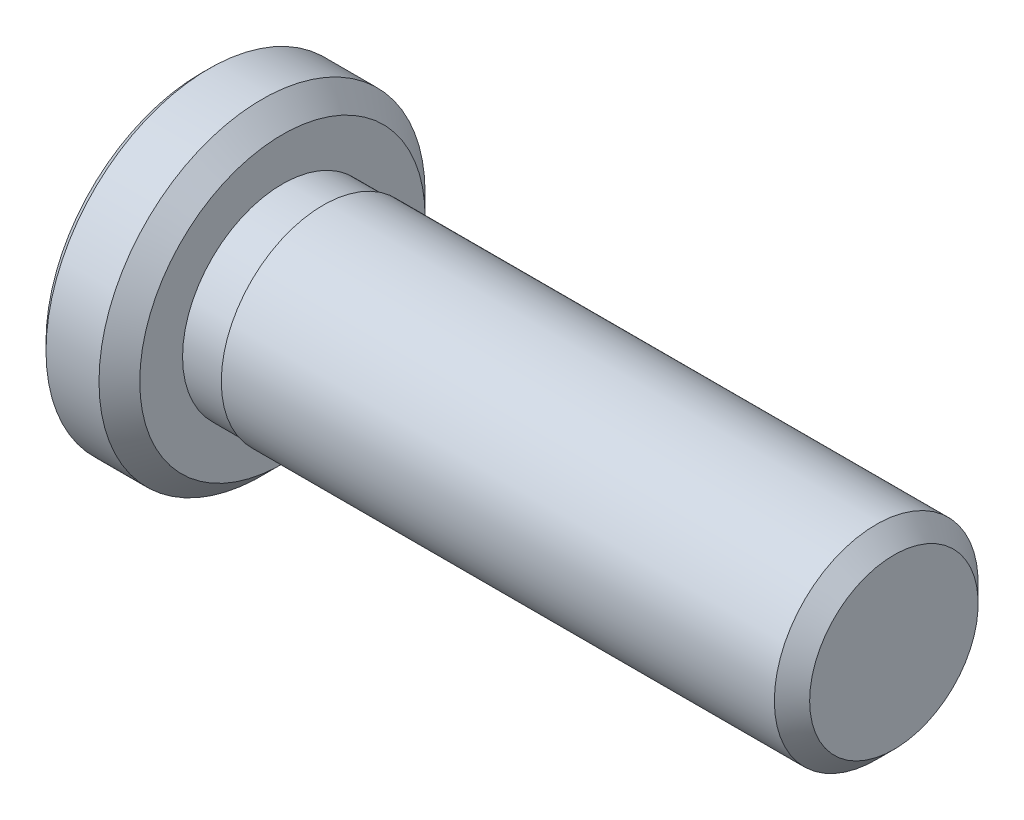
ISO-10303-21;
HEADER;
FILE_DESCRIPTION(('STEP AP214'),'2;1');
FILE_NAME('part.step','',(''),(''),'','','');
FILE_SCHEMA(('AUTOMOTIVE_DESIGN { 1 0 10303 214 1 1 1 1 }'));
ENDSEC;
DATA;
#1=APPLICATION_CONTEXT('core data for automotive mechanical design processes');
#2=APPLICATION_PROTOCOL_DEFINITION('international standard','automotive_design',2000,#1);
#3=PRODUCT_CONTEXT('',#1,'mechanical');
#4=PRODUCT('Part','Part','',(#3));
#5=PRODUCT_RELATED_PRODUCT_CATEGORY('part','',(#4));
#6=PRODUCT_DEFINITION_FORMATION('','',#4);
#7=PRODUCT_DEFINITION_CONTEXT('part definition',#1,'design');
#8=PRODUCT_DEFINITION('design','',#6,#7);
#9=PRODUCT_DEFINITION_SHAPE('','',#8);
#10=(LENGTH_UNIT() NAMED_UNIT(*) SI_UNIT(.MILLI.,.METRE.));
#11=(NAMED_UNIT(*) PLANE_ANGLE_UNIT() SI_UNIT($,.RADIAN.));
#12=(NAMED_UNIT(*) SI_UNIT($,.STERADIAN.) SOLID_ANGLE_UNIT());
#13=UNCERTAINTY_MEASURE_WITH_UNIT(LENGTH_MEASURE(1.E-05),#10,'distance_accuracy_value','');
#14=(GEOMETRIC_REPRESENTATION_CONTEXT(3) GLOBAL_UNCERTAINTY_ASSIGNED_CONTEXT((#13)) GLOBAL_UNIT_ASSIGNED_CONTEXT((#10,
#11,#12)) REPRESENTATION_CONTEXT('',''));
#15=CARTESIAN_POINT('',(0.,0.,0.));
#16=DIRECTION('',(0.,0.,1.));
#17=DIRECTION('',(1.,0.,0.));
#18=AXIS2_PLACEMENT_3D('',#15,#16,#17);
#19=CARTESIAN_POINT('',(-2.,0.,0.));
#20=DIRECTION('',(1.,0.,0.));
#21=DIRECTION('',(0.,0.,-1.));
#22=AXIS2_PLACEMENT_3D('',#19,#20,#21);
#23=PLANE('',#22);
#24=DIRECTION('',(0.,0.,1.));
#25=VECTOR('',#24,1.);
#26=CARTESIAN_POINT('',(-2.,-1.25,-0.72168783648703));
#27=LINE('',#26,#25);
#28=CARTESIAN_POINT('',(-2.,-1.25,-0.72168783648703));
#29=VERTEX_POINT('',#28);
#30=CARTESIAN_POINT('',(-2.,-1.25,0.72168783648703));
#31=VERTEX_POINT('',#30);
#32=EDGE_CURVE('E105',#29,#31,#27,.T.);
#33=ORIENTED_EDGE('',*,*,#32,.F.);
#34=DIRECTION('',(0.,-0.866025403784427,0.50000000000002));
#35=VECTOR('',#34,1.);
#36=CARTESIAN_POINT('',(-2.,0.,-1.4433756729741));
#37=LINE('',#36,#35);
#38=CARTESIAN_POINT('',(-2.,0.,-1.4433756729741));
#39=VERTEX_POINT('',#38);
#40=EDGE_CURVE('E31',#39,#29,#37,.T.);
#41=ORIENTED_EDGE('',*,*,#40,.F.);
#42=DIRECTION('',(0.,-0.866025403784427,-0.50000000000002));
#43=VECTOR('',#42,1.);
#44=CARTESIAN_POINT('',(-2.,1.25,-0.72168783648703));
#45=LINE('',#44,#43);
#46=CARTESIAN_POINT('',(-2.,1.25,-0.72168783648703));
#47=VERTEX_POINT('',#46);
#48=EDGE_CURVE('E114',#47,#39,#45,.T.);
#49=ORIENTED_EDGE('',*,*,#48,.F.);
#50=DIRECTION('',(0.,0.,-1.));
#51=VECTOR('',#50,1.);
#52=CARTESIAN_POINT('',(-2.,1.25,0.72168783648703));
#53=LINE('',#52,#51);
#54=CARTESIAN_POINT('',(-2.,1.25,0.72168783648703));
#55=VERTEX_POINT('',#54);
#56=EDGE_CURVE('E112',#55,#47,#53,.T.);
#57=ORIENTED_EDGE('',*,*,#56,.F.);
#58=DIRECTION('',(0.,0.866025403784427,-0.50000000000002));
#59=VECTOR('',#58,1.);
#60=CARTESIAN_POINT('',(-2.,0.,1.4433756729741));
#61=LINE('',#60,#59);
#62=CARTESIAN_POINT('',(-2.,0.,1.4433756729741));
#63=VERTEX_POINT('',#62);
#64=EDGE_CURVE('E79',#63,#55,#61,.T.);
#65=ORIENTED_EDGE('',*,*,#64,.F.);
#66=DIRECTION('',(0.,0.866025403784427,0.50000000000002));
#67=VECTOR('',#66,1.);
#68=CARTESIAN_POINT('',(-2.,-1.25,0.72168783648703));
#69=LINE('',#68,#67);
#70=EDGE_CURVE('E108',#31,#63,#69,.T.);
#71=ORIENTED_EDGE('',*,*,#70,.F.);
#72=EDGE_LOOP('',(#33,#41,#49,#57,#65,#71));
#73=FACE_BOUND('',#72,.T.);
#74=CARTESIAN_POINT('',(-2.,0.,0.));
#75=DIRECTION('',(-1.,0.,0.));
#76=DIRECTION('',(0.,0.,1.));
#77=AXIS2_PLACEMENT_3D('',#74,#75,#76);
#78=CIRCLE('',#77,3.8);
#79=CARTESIAN_POINT('',(-2.,0.,3.8));
#80=VERTEX_POINT('',#79);
#81=EDGE_CURVE('E11',#80,#80,#78,.T.);
#82=ORIENTED_EDGE('',*,*,#81,.T.);
#83=EDGE_LOOP('',(#82));
#84=FACE_BOUND('',#83,.T.);
#85=ADVANCED_FACE('F17',(#73,#84),#23,.F.);
#86=CARTESIAN_POINT('',(-1.8,0.,0.));
#87=DIRECTION('',(1.,0.,0.));
#88=DIRECTION('',(0.,0.,-1.));
#89=AXIS2_PLACEMENT_3D('',#86,#87,#88);
#90=CONICAL_SURFACE('',#89,4.,0.785398163397443);
#91=ORIENTED_EDGE('',*,*,#81,.F.);
#92=EDGE_LOOP('',(#91));
#93=FACE_BOUND('',#92,.T.);
#94=CARTESIAN_POINT('',(-1.8,0.,0.));
#95=DIRECTION('',(-1.,0.,0.));
#96=DIRECTION('',(0.,0.,1.));
#97=AXIS2_PLACEMENT_3D('',#94,#95,#96);
#98=CIRCLE('',#97,4.);
#99=CARTESIAN_POINT('',(-1.8,0.,4.));
#100=VERTEX_POINT('',#99);
#101=EDGE_CURVE('E24',#100,#100,#98,.T.);
#102=ORIENTED_EDGE('',*,*,#101,.T.);
#103=EDGE_LOOP('',(#102));
#104=FACE_BOUND('',#103,.T.);
#105=ADVANCED_FACE('F146',(#93,#104),#90,.T.);
#106=CARTESIAN_POINT('',(15.,0.,0.));
#107=DIRECTION('',(-1.,0.,0.));
#108=DIRECTION('',(0.,0.,1.));
#109=AXIS2_PLACEMENT_3D('',#106,#107,#108);
#110=CYLINDRICAL_SURFACE('',#109,4.);
#111=ORIENTED_EDGE('',*,*,#101,.F.);
#112=EDGE_LOOP('',(#111));
#113=FACE_BOUND('',#112,.T.);
#114=CARTESIAN_POINT('',(-0.5,0.,0.));
#115=DIRECTION('',(-1.,0.,0.));
#116=DIRECTION('',(0.,0.,1.));
#117=AXIS2_PLACEMENT_3D('',#114,#115,#116);
#118=CIRCLE('',#117,4.);
#119=CARTESIAN_POINT('',(-0.5,0.,4.));
#120=VERTEX_POINT('',#119);
#121=EDGE_CURVE('E141',#120,#120,#118,.T.);
#122=ORIENTED_EDGE('',*,*,#121,.T.);
#123=EDGE_LOOP('',(#122));
#124=FACE_BOUND('',#123,.T.);
#125=ADVANCED_FACE('F148',(#113,#124),#110,.T.);
#126=CARTESIAN_POINT('',(0.,0.,0.));
#127=DIRECTION('',(-1.,0.,0.));
#128=DIRECTION('',(0.,0.,1.));
#129=AXIS2_PLACEMENT_3D('',#126,#127,#128);
#130=CONICAL_SURFACE('',#129,3.5,0.785398163397448);
#131=ORIENTED_EDGE('',*,*,#121,.F.);
#132=EDGE_LOOP('',(#131));
#133=FACE_BOUND('',#132,.T.);
#134=CARTESIAN_POINT('',(0.,0.,0.));
#135=DIRECTION('',(-1.,0.,0.));
#136=DIRECTION('',(0.,0.,1.));
#137=AXIS2_PLACEMENT_3D('',#134,#135,#136);
#138=CIRCLE('',#137,3.5);
#139=CARTESIAN_POINT('',(0.,0.,3.5));
#140=VERTEX_POINT('',#139);
#141=EDGE_CURVE('E138',#140,#140,#138,.T.);
#142=ORIENTED_EDGE('',*,*,#141,.T.);
#143=EDGE_LOOP('',(#142));
#144=FACE_BOUND('',#143,.T.);
#145=ADVANCED_FACE('F151',(#133,#144),#130,.T.);
#146=CARTESIAN_POINT('',(0.,3.5,0.));
#147=DIRECTION('',(-1.,0.,0.));
#148=DIRECTION('',(0.,0.,1.));
#149=AXIS2_PLACEMENT_3D('',#146,#147,#148);
#150=PLANE('',#149);
#151=ORIENTED_EDGE('',*,*,#141,.F.);
#152=EDGE_LOOP('',(#151));
#153=FACE_BOUND('',#152,.T.);
#154=CARTESIAN_POINT('',(0.,0.,0.));
#155=DIRECTION('',(-1.,0.,0.));
#156=DIRECTION('',(0.,0.,1.));
#157=AXIS2_PLACEMENT_3D('',#154,#155,#156);
#158=CIRCLE('',#157,2.45);
#159=CARTESIAN_POINT('',(0.,0.,2.45));
#160=VERTEX_POINT('',#159);
#161=EDGE_CURVE('E135',#160,#160,#158,.T.);
#162=ORIENTED_EDGE('',*,*,#161,.T.);
#163=EDGE_LOOP('',(#162));
#164=FACE_BOUND('',#163,.T.);
#165=ADVANCED_FACE('F157',(#153,#164),#150,.F.);
#166=CARTESIAN_POINT('',(15.,0.,0.));
#167=DIRECTION('',(-1.,0.,0.));
#168=DIRECTION('',(0.,0.,1.));
#169=AXIS2_PLACEMENT_3D('',#166,#167,#168);
#170=CYLINDRICAL_SURFACE('',#169,2.45);
#171=ORIENTED_EDGE('',*,*,#161,.F.);
#172=EDGE_LOOP('',(#171));
#173=FACE_BOUND('',#172,.T.);
#174=CARTESIAN_POINT('',(1.,0.,0.));
#175=DIRECTION('',(-1.,0.,0.));
#176=DIRECTION('',(0.,0.,1.));
#177=AXIS2_PLACEMENT_3D('',#174,#175,#176);
#178=CIRCLE('',#177,2.45);
#179=CARTESIAN_POINT('',(1.,0.,2.45));
#180=VERTEX_POINT('',#179);
#181=EDGE_CURVE('E132',#180,#180,#178,.T.);
#182=ORIENTED_EDGE('',*,*,#181,.T.);
#183=EDGE_LOOP('',(#182));
#184=FACE_BOUND('',#183,.T.);
#185=ADVANCED_FACE('F163',(#173,#184),#170,.T.);
#186=CARTESIAN_POINT('',(1.,2.45,0.));
#187=DIRECTION('',(1.,0.,0.));
#188=DIRECTION('',(0.,0.,-1.));
#189=AXIS2_PLACEMENT_3D('',#186,#187,#188);
#190=PLANE('',#189);
#191=ORIENTED_EDGE('',*,*,#181,.F.);
#192=EDGE_LOOP('',(#191));
#193=FACE_BOUND('',#192,.T.);
#194=CARTESIAN_POINT('',(1.,0.,0.));
#195=DIRECTION('',(-1.,0.,0.));
#196=DIRECTION('',(0.,0.,1.));
#197=AXIS2_PLACEMENT_3D('',#194,#195,#196);
#198=CIRCLE('',#197,2.5);
#199=CARTESIAN_POINT('',(1.,0.,2.5));
#200=VERTEX_POINT('',#199);
#201=EDGE_CURVE('E129',#200,#200,#198,.T.);
#202=ORIENTED_EDGE('',*,*,#201,.T.);
#203=EDGE_LOOP('',(#202));
#204=FACE_BOUND('',#203,.T.);
#205=ADVANCED_FACE('F169',(#193,#204),#190,.F.);
#206=CARTESIAN_POINT('',(15.,0.,0.));
#207=DIRECTION('',(-1.,0.,0.));
#208=DIRECTION('',(0.,0.,1.));
#209=AXIS2_PLACEMENT_3D('',#206,#207,#208);
#210=CYLINDRICAL_SURFACE('',#209,2.5);
#211=ORIENTED_EDGE('',*,*,#201,.F.);
#212=EDGE_LOOP('',(#211));
#213=FACE_BOUND('',#212,.T.);
#214=CARTESIAN_POINT('',(14.567,0.,0.));
#215=DIRECTION('',(-1.,0.,0.));
#216=DIRECTION('',(0.,0.,1.));
#217=AXIS2_PLACEMENT_3D('',#214,#215,#216);
#218=CIRCLE('',#217,2.5);
#219=CARTESIAN_POINT('',(14.567,0.,2.5));
#220=VERTEX_POINT('',#219);
#221=EDGE_CURVE('E126',#220,#220,#218,.T.);
#222=ORIENTED_EDGE('',*,*,#221,.T.);
#223=EDGE_LOOP('',(#222));
#224=FACE_BOUND('',#223,.T.);
#225=ADVANCED_FACE('F175',(#213,#224),#210,.T.);
#226=CARTESIAN_POINT('',(15.,0.,0.));
#227=DIRECTION('',(-1.,0.,0.));
#228=DIRECTION('',(0.,0.,1.));
#229=AXIS2_PLACEMENT_3D('',#226,#227,#228);
#230=CONICAL_SURFACE('',#229,2.067,0.785398163397449);
#231=ORIENTED_EDGE('',*,*,#221,.F.);
#232=EDGE_LOOP('',(#231));
#233=FACE_BOUND('',#232,.T.);
#234=CARTESIAN_POINT('',(15.,0.,0.));
#235=DIRECTION('',(-1.,0.,0.));
#236=DIRECTION('',(0.,0.,1.));
#237=AXIS2_PLACEMENT_3D('',#234,#235,#236);
#238=CIRCLE('',#237,2.067);
#239=CARTESIAN_POINT('',(15.,0.,2.067));
#240=VERTEX_POINT('',#239);
#241=EDGE_CURVE('E118',#240,#240,#238,.T.);
#242=ORIENTED_EDGE('',*,*,#241,.T.);
#243=EDGE_LOOP('',(#242));
#244=FACE_BOUND('',#243,.T.);
#245=ADVANCED_FACE('F181',(#233,#244),#230,.T.);
#246=CARTESIAN_POINT('',(15.,2.067,0.));
#247=DIRECTION('',(-1.,0.,0.));
#248=DIRECTION('',(0.,0.,1.));
#249=AXIS2_PLACEMENT_3D('',#246,#247,#248);
#250=PLANE('',#249);
#251=ORIENTED_EDGE('',*,*,#241,.F.);
#252=EDGE_LOOP('',(#251));
#253=FACE_BOUND('',#252,.T.);
#254=ADVANCED_FACE('F187',(#253),#250,.F.);
#255=CARTESIAN_POINT('',(-0.6,0.,-1.4433756729741));
#256=DIRECTION('',(0.,-0.50000000000002,-0.866025403784427));
#257=DIRECTION('',(0.,0.866025403784427,-0.50000000000002));
#258=AXIS2_PLACEMENT_3D('',#255,#256,#257);
#259=PLANE('',#258);
#260=ORIENTED_EDGE('',*,*,#40,.T.);
#261=DIRECTION('',(-1.,0.,0.));
#262=VECTOR('',#261,1.);
#263=CARTESIAN_POINT('',(-0.6,-1.25,-0.72168783648703));
#264=LINE('',#263,#262);
#265=CARTESIAN_POINT('',(-0.6,-1.25,-0.72168783648703));
#266=VERTEX_POINT('',#265);
#267=EDGE_CURVE('E61',#266,#29,#264,.T.);
#268=ORIENTED_EDGE('',*,*,#267,.F.);
#269=DIRECTION('',(0.,-0.866025403784427,0.50000000000002));
#270=VECTOR('',#269,1.);
#271=CARTESIAN_POINT('',(-0.6,0.,-1.4433756729741));
#272=LINE('',#271,#270);
#273=CARTESIAN_POINT('',(-0.6,0.,-1.4433756729741));
#274=VERTEX_POINT('',#273);
#275=EDGE_CURVE('E116',#274,#266,#272,.T.);
#276=ORIENTED_EDGE('',*,*,#275,.F.);
#277=DIRECTION('',(-1.,0.,0.));
#278=VECTOR('',#277,1.);
#279=CARTESIAN_POINT('',(-0.6,0.,-1.4433756729741));
#280=LINE('',#279,#278);
#281=EDGE_CURVE('E39',#274,#39,#280,.T.);
#282=ORIENTED_EDGE('',*,*,#281,.T.);
#283=EDGE_LOOP('',(#260,#268,#276,#282));
#284=FACE_BOUND('',#283,.T.);
#285=ADVANCED_FACE('F192',(#284),#259,.F.);
#286=CARTESIAN_POINT('',(-0.6,1.25,-0.72168783648703));
#287=DIRECTION('',(0.,0.50000000000002,-0.866025403784427));
#288=DIRECTION('',(0.,0.866025403784427,0.50000000000002));
#289=AXIS2_PLACEMENT_3D('',#286,#287,#288);
#290=PLANE('',#289);
#291=ORIENTED_EDGE('',*,*,#48,.T.);
#292=ORIENTED_EDGE('',*,*,#281,.F.);
#293=DIRECTION('',(0.,-0.866025403784427,-0.50000000000002));
#294=VECTOR('',#293,1.);
#295=CARTESIAN_POINT('',(-0.6,1.25,-0.72168783648703));
#296=LINE('',#295,#294);
#297=CARTESIAN_POINT('',(-0.6,1.25,-0.72168783648703));
#298=VERTEX_POINT('',#297);
#299=EDGE_CURVE('E91',#298,#274,#296,.T.);
#300=ORIENTED_EDGE('',*,*,#299,.F.);
#301=DIRECTION('',(-1.,0.,0.));
#302=VECTOR('',#301,1.);
#303=CARTESIAN_POINT('',(-0.6,1.25,-0.72168783648703));
#304=LINE('',#303,#302);
#305=EDGE_CURVE('E83',#298,#47,#304,.T.);
#306=ORIENTED_EDGE('',*,*,#305,.T.);
#307=EDGE_LOOP('',(#291,#292,#300,#306));
#308=FACE_BOUND('',#307,.T.);
#309=ADVANCED_FACE('F199',(#308),#290,.F.);
#310=CARTESIAN_POINT('',(-0.6,1.25,0.72168783648703));
#311=DIRECTION('',(0.,1.,0.));
#312=DIRECTION('',(0.,0.,1.));
#313=AXIS2_PLACEMENT_3D('',#310,#311,#312);
#314=PLANE('',#313);
#315=ORIENTED_EDGE('',*,*,#56,.T.);
#316=ORIENTED_EDGE('',*,*,#305,.F.);
#317=DIRECTION('',(0.,0.,-1.));
#318=VECTOR('',#317,1.);
#319=CARTESIAN_POINT('',(-0.6,1.25,0.72168783648703));
#320=LINE('',#319,#318);
#321=CARTESIAN_POINT('',(-0.6,1.25,0.72168783648703));
#322=VERTEX_POINT('',#321);
#323=EDGE_CURVE('E87',#322,#298,#320,.T.);
#324=ORIENTED_EDGE('',*,*,#323,.F.);
#325=DIRECTION('',(-1.,0.,0.));
#326=VECTOR('',#325,1.);
#327=CARTESIAN_POINT('',(-0.6,1.25,0.72168783648703));
#328=LINE('',#327,#326);
#329=EDGE_CURVE('E72',#322,#55,#328,.T.);
#330=ORIENTED_EDGE('',*,*,#329,.T.);
#331=EDGE_LOOP('',(#315,#316,#324,#330));
#332=FACE_BOUND('',#331,.T.);
#333=ADVANCED_FACE('F88',(#332),#314,.F.);
#334=CARTESIAN_POINT('',(-0.6,0.,1.4433756729741));
#335=DIRECTION('',(0.,0.50000000000002,0.866025403784427));
#336=DIRECTION('',(0.,-0.866025403784427,0.50000000000002));
#337=AXIS2_PLACEMENT_3D('',#334,#335,#336);
#338=PLANE('',#337);
#339=ORIENTED_EDGE('',*,*,#64,.T.);
#340=ORIENTED_EDGE('',*,*,#329,.F.);
#341=DIRECTION('',(0.,0.866025403784427,-0.50000000000002));
#342=VECTOR('',#341,1.);
#343=CARTESIAN_POINT('',(-0.6,0.,1.4433756729741));
#344=LINE('',#343,#342);
#345=CARTESIAN_POINT('',(-0.6,0.,1.4433756729741));
#346=VERTEX_POINT('',#345);
#347=EDGE_CURVE('E76',#346,#322,#344,.T.);
#348=ORIENTED_EDGE('',*,*,#347,.F.);
#349=DIRECTION('',(-1.,0.,0.));
#350=VECTOR('',#349,1.);
#351=CARTESIAN_POINT('',(-0.6,0.,1.4433756729741));
#352=LINE('',#351,#350);
#353=EDGE_CURVE('E84',#346,#63,#352,.T.);
#354=ORIENTED_EDGE('',*,*,#353,.T.);
#355=EDGE_LOOP('',(#339,#340,#348,#354));
#356=FACE_BOUND('',#355,.T.);
#357=ADVANCED_FACE('F74',(#356),#338,.F.);
#358=CARTESIAN_POINT('',(-0.6,-1.25,0.72168783648703));
#359=DIRECTION('',(0.,-0.50000000000002,0.866025403784427));
#360=DIRECTION('',(0.,-0.866025403784427,-0.50000000000002));
#361=AXIS2_PLACEMENT_3D('',#358,#359,#360);
#362=PLANE('',#361);
#363=ORIENTED_EDGE('',*,*,#70,.T.);
#364=ORIENTED_EDGE('',*,*,#353,.F.);
#365=DIRECTION('',(0.,0.866025403784427,0.50000000000002));
#366=VECTOR('',#365,1.);
#367=CARTESIAN_POINT('',(-0.6,-1.25,0.72168783648703));
#368=LINE('',#367,#366);
#369=CARTESIAN_POINT('',(-0.6,-1.25,0.72168783648703));
#370=VERTEX_POINT('',#369);
#371=EDGE_CURVE('E97',#370,#346,#368,.T.);
#372=ORIENTED_EDGE('',*,*,#371,.F.);
#373=DIRECTION('',(-1.,0.,0.));
#374=VECTOR('',#373,1.);
#375=CARTESIAN_POINT('',(-0.6,-1.25,0.72168783648703));
#376=LINE('',#375,#374);
#377=EDGE_CURVE('E121',#370,#31,#376,.T.);
#378=ORIENTED_EDGE('',*,*,#377,.T.);
#379=EDGE_LOOP('',(#363,#364,#372,#378));
#380=FACE_BOUND('',#379,.T.);
#381=ADVANCED_FACE('F227',(#380),#362,.F.);
#382=CARTESIAN_POINT('',(-0.6,-1.25,-0.72168783648703));
#383=DIRECTION('',(0.,-1.,0.));
#384=DIRECTION('',(0.,0.,-1.));
#385=AXIS2_PLACEMENT_3D('',#382,#383,#384);
#386=PLANE('',#385);
#387=ORIENTED_EDGE('',*,*,#32,.T.);
#388=ORIENTED_EDGE('',*,*,#377,.F.);
#389=DIRECTION('',(0.,0.,1.));
#390=VECTOR('',#389,1.);
#391=CARTESIAN_POINT('',(-0.6,-1.25,-0.72168783648703));
#392=LINE('',#391,#390);
#393=EDGE_CURVE('E99',#266,#370,#392,.T.);
#394=ORIENTED_EDGE('',*,*,#393,.F.);
#395=ORIENTED_EDGE('',*,*,#267,.T.);
#396=EDGE_LOOP('',(#387,#388,#394,#395));
#397=FACE_BOUND('',#396,.T.);
#398=ADVANCED_FACE('F214',(#397),#386,.F.);
#399=CARTESIAN_POINT('',(-0.6,-1.25,-0.72168783648703));
#400=DIRECTION('',(-1.,0.,0.));
#401=DIRECTION('',(0.,0.,1.));
#402=AXIS2_PLACEMENT_3D('',#399,#400,#401);
#403=PLANE('',#402);
#404=ORIENTED_EDGE('',*,*,#275,.T.);
#405=ORIENTED_EDGE('',*,*,#393,.T.);
#406=ORIENTED_EDGE('',*,*,#371,.T.);
#407=ORIENTED_EDGE('',*,*,#347,.T.);
#408=ORIENTED_EDGE('',*,*,#323,.T.);
#409=ORIENTED_EDGE('',*,*,#299,.T.);
#410=EDGE_LOOP('',(#404,#405,#406,#407,#408,#409));
#411=FACE_BOUND('',#410,.T.);
#412=ADVANCED_FACE('F94',(#411),#403,.T.);
#413=CLOSED_SHELL('',(#85,#105,#125,#145,#165,#185,#205,#225,#245,#254,#285,#309,#333,#357,#381,
#398,#412));
#414=MANIFOLD_SOLID_BREP('B1',#413);
#415=ADVANCED_BREP_SHAPE_REPRESENTATION('',(#18,#414),#14);
#416=SHAPE_DEFINITION_REPRESENTATION(#9,#415);
ENDSEC;
END-ISO-10303-21;
